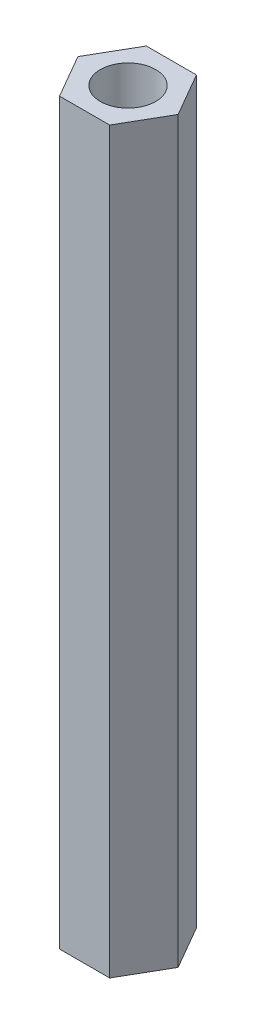
ISO-10303-21;
HEADER;
FILE_DESCRIPTION(('STEP AP214'),'2;1');
FILE_NAME('part.step','',(''),(''),'','','');
FILE_SCHEMA(('AUTOMOTIVE_DESIGN { 1 0 10303 214 1 1 1 1 }'));
ENDSEC;
DATA;
#1=APPLICATION_CONTEXT('core data for automotive mechanical design processes');
#2=APPLICATION_PROTOCOL_DEFINITION('international standard','automotive_design',2000,#1);
#3=PRODUCT_CONTEXT('',#1,'mechanical');
#4=PRODUCT('Part','Part','',(#3));
#5=PRODUCT_RELATED_PRODUCT_CATEGORY('part','',(#4));
#6=PRODUCT_DEFINITION_FORMATION('','',#4);
#7=PRODUCT_DEFINITION_CONTEXT('part definition',#1,'design');
#8=PRODUCT_DEFINITION('design','',#6,#7);
#9=PRODUCT_DEFINITION_SHAPE('','',#8);
#10=(LENGTH_UNIT() NAMED_UNIT(*) SI_UNIT(.MILLI.,.METRE.));
#11=(NAMED_UNIT(*) PLANE_ANGLE_UNIT() SI_UNIT($,.RADIAN.));
#12=(NAMED_UNIT(*) SI_UNIT($,.STERADIAN.) SOLID_ANGLE_UNIT());
#13=UNCERTAINTY_MEASURE_WITH_UNIT(LENGTH_MEASURE(1.E-05),#10,'distance_accuracy_value','');
#14=(GEOMETRIC_REPRESENTATION_CONTEXT(3) GLOBAL_UNCERTAINTY_ASSIGNED_CONTEXT((#13)) GLOBAL_UNIT_ASSIGNED_CONTEXT((#10,
#11,#12)) REPRESENTATION_CONTEXT('',''));
#15=CARTESIAN_POINT('',(0.,0.,0.));
#16=DIRECTION('',(0.,0.,1.));
#17=DIRECTION('',(1.,0.,0.));
#18=AXIS2_PLACEMENT_3D('',#15,#16,#17);
#19=CARTESIAN_POINT('',(0.,40.,0.));
#20=DIRECTION('',(0.,1.,0.));
#21=DIRECTION('',(0.,0.,1.));
#22=AXIS2_PLACEMENT_3D('',#19,#20,#21);
#23=PLANE('',#22);
#24=DIRECTION('',(0.5,0.,-0.866025403784439));
#25=VECTOR('',#24,1.);
#26=CARTESIAN_POINT('',(1.35677313259562,40.,2.35));
#27=LINE('',#26,#25);
#28=CARTESIAN_POINT('',(1.35677313259562,40.,2.35));
#29=VERTEX_POINT('',#28);
#30=CARTESIAN_POINT('',(2.71354626519124,40.,0.));
#31=VERTEX_POINT('',#30);
#32=EDGE_CURVE('E131',#29,#31,#27,.T.);
#33=ORIENTED_EDGE('',*,*,#32,.T.);
#34=DIRECTION('',(-0.5,0.,-0.866025403784439));
#35=VECTOR('',#34,1.);
#36=CARTESIAN_POINT('',(2.71354626519124,40.,0.));
#37=LINE('',#36,#35);
#38=CARTESIAN_POINT('',(1.35677313259562,40.,-2.35));
#39=VERTEX_POINT('',#38);
#40=EDGE_CURVE('E89',#31,#39,#37,.T.);
#41=ORIENTED_EDGE('',*,*,#40,.T.);
#42=DIRECTION('',(-1.,0.,0.));
#43=VECTOR('',#42,1.);
#44=CARTESIAN_POINT('',(1.35677313259562,40.,-2.35));
#45=LINE('',#44,#43);
#46=CARTESIAN_POINT('',(-1.35677313259562,40.,-2.35));
#47=VERTEX_POINT('',#46);
#48=EDGE_CURVE('E102',#39,#47,#45,.T.);
#49=ORIENTED_EDGE('',*,*,#48,.T.);
#50=DIRECTION('',(-0.5,0.,0.866025403784439));
#51=VECTOR('',#50,1.);
#52=CARTESIAN_POINT('',(-1.35677313259562,40.,-2.35));
#53=LINE('',#52,#51);
#54=CARTESIAN_POINT('',(-2.71354626519124,40.,0.));
#55=VERTEX_POINT('',#54);
#56=EDGE_CURVE('E96',#47,#55,#53,.T.);
#57=ORIENTED_EDGE('',*,*,#56,.T.);
#58=DIRECTION('',(0.5,0.,0.866025403784439));
#59=VECTOR('',#58,1.);
#60=CARTESIAN_POINT('',(-2.71354626519124,40.,0.));
#61=LINE('',#60,#59);
#62=CARTESIAN_POINT('',(-1.35677313259562,40.,2.35));
#63=VERTEX_POINT('',#62);
#64=EDGE_CURVE('E100',#55,#63,#61,.T.);
#65=ORIENTED_EDGE('',*,*,#64,.T.);
#66=DIRECTION('',(1.,0.,0.));
#67=VECTOR('',#66,1.);
#68=CARTESIAN_POINT('',(-1.35677313259562,40.,2.35));
#69=LINE('',#68,#67);
#70=EDGE_CURVE('E52',#63,#29,#69,.T.);
#71=ORIENTED_EDGE('',*,*,#70,.T.);
#72=EDGE_LOOP('',(#33,#41,#49,#57,#65,#71));
#73=FACE_BOUND('',#72,.T.);
#74=CARTESIAN_POINT('',(0.,40.,0.));
#75=DIRECTION('',(0.,1.,0.));
#76=DIRECTION('',(0.,0.,1.));
#77=AXIS2_PLACEMENT_3D('',#74,#75,#76);
#78=CIRCLE('',#77,1.5);
#79=CARTESIAN_POINT('',(0.,40.,1.5));
#80=VERTEX_POINT('',#79);
#81=EDGE_CURVE('E124',#80,#80,#78,.T.);
#82=ORIENTED_EDGE('',*,*,#81,.F.);
#83=EDGE_LOOP('',(#82));
#84=FACE_BOUND('',#83,.T.);
#85=ADVANCED_FACE('F35',(#73,#84),#23,.T.);
#86=CARTESIAN_POINT('',(0.,0.,0.));
#87=DIRECTION('',(0.,1.,0.));
#88=DIRECTION('',(0.,0.,1.));
#89=AXIS2_PLACEMENT_3D('',#86,#87,#88);
#90=PLANE('',#89);
#91=DIRECTION('',(0.5,0.,-0.866025403784439));
#92=VECTOR('',#91,1.);
#93=CARTESIAN_POINT('',(1.35677313259562,0.,2.35));
#94=LINE('',#93,#92);
#95=CARTESIAN_POINT('',(1.35677313259562,0.,2.35));
#96=VERTEX_POINT('',#95);
#97=CARTESIAN_POINT('',(2.71354626519124,0.,0.));
#98=VERTEX_POINT('',#97);
#99=EDGE_CURVE('E120',#96,#98,#94,.T.);
#100=ORIENTED_EDGE('',*,*,#99,.F.);
#101=DIRECTION('',(1.,0.,0.));
#102=VECTOR('',#101,1.);
#103=CARTESIAN_POINT('',(-1.35677313259562,0.,2.35));
#104=LINE('',#103,#102);
#105=CARTESIAN_POINT('',(-1.35677313259562,0.,2.35));
#106=VERTEX_POINT('',#105);
#107=EDGE_CURVE('E81',#106,#96,#104,.T.);
#108=ORIENTED_EDGE('',*,*,#107,.F.);
#109=DIRECTION('',(0.5,0.,0.866025403784439));
#110=VECTOR('',#109,1.);
#111=CARTESIAN_POINT('',(-2.71354626519124,0.,0.));
#112=LINE('',#111,#110);
#113=CARTESIAN_POINT('',(-2.71354626519124,0.,0.));
#114=VERTEX_POINT('',#113);
#115=EDGE_CURVE('E75',#114,#106,#112,.T.);
#116=ORIENTED_EDGE('',*,*,#115,.F.);
#117=DIRECTION('',(-0.5,0.,0.866025403784439));
#118=VECTOR('',#117,1.);
#119=CARTESIAN_POINT('',(-1.35677313259562,0.,-2.35));
#120=LINE('',#119,#118);
#121=CARTESIAN_POINT('',(-1.35677313259562,0.,-2.35));
#122=VERTEX_POINT('',#121);
#123=EDGE_CURVE('E110',#122,#114,#120,.T.);
#124=ORIENTED_EDGE('',*,*,#123,.F.);
#125=DIRECTION('',(-1.,0.,0.));
#126=VECTOR('',#125,1.);
#127=CARTESIAN_POINT('',(1.35677313259562,0.,-2.35));
#128=LINE('',#127,#126);
#129=CARTESIAN_POINT('',(1.35677313259562,0.,-2.35));
#130=VERTEX_POINT('',#129);
#131=EDGE_CURVE('E126',#130,#122,#128,.T.);
#132=ORIENTED_EDGE('',*,*,#131,.F.);
#133=DIRECTION('',(-0.5,0.,-0.866025403784439));
#134=VECTOR('',#133,1.);
#135=CARTESIAN_POINT('',(2.71354626519124,0.,0.));
#136=LINE('',#135,#134);
#137=EDGE_CURVE('E123',#98,#130,#136,.T.);
#138=ORIENTED_EDGE('',*,*,#137,.F.);
#139=EDGE_LOOP('',(#100,#108,#116,#124,#132,#138));
#140=FACE_BOUND('',#139,.T.);
#141=CARTESIAN_POINT('',(0.,0.,0.));
#142=DIRECTION('',(0.,1.,0.));
#143=DIRECTION('',(0.,0.,1.));
#144=AXIS2_PLACEMENT_3D('',#141,#142,#143);
#145=CIRCLE('',#144,1.5);
#146=CARTESIAN_POINT('',(0.,0.,1.5));
#147=VERTEX_POINT('',#146);
#148=EDGE_CURVE('E224',#147,#147,#145,.T.);
#149=ORIENTED_EDGE('',*,*,#148,.T.);
#150=EDGE_LOOP('',(#149));
#151=FACE_BOUND('',#150,.T.);
#152=ADVANCED_FACE('F140',(#140,#151),#90,.F.);
#153=CARTESIAN_POINT('',(1.35677313259562,40.,2.35));
#154=DIRECTION('',(-0.866025403784439,0.,-0.5));
#155=DIRECTION('',(-0.5,0.,0.866025403784439));
#156=AXIS2_PLACEMENT_3D('',#153,#154,#155);
#157=PLANE('',#156);
#158=ORIENTED_EDGE('',*,*,#99,.T.);
#159=DIRECTION('',(0.,-1.,0.));
#160=VECTOR('',#159,1.);
#161=CARTESIAN_POINT('',(2.71354626519124,40.,0.));
#162=LINE('',#161,#160);
#163=EDGE_CURVE('E11',#31,#98,#162,.T.);
#164=ORIENTED_EDGE('',*,*,#163,.F.);
#165=ORIENTED_EDGE('',*,*,#32,.F.);
#166=DIRECTION('',(0.,-1.,0.));
#167=VECTOR('',#166,1.);
#168=CARTESIAN_POINT('',(1.35677313259562,40.,2.35));
#169=LINE('',#168,#167);
#170=EDGE_CURVE('E116',#29,#96,#169,.T.);
#171=ORIENTED_EDGE('',*,*,#170,.T.);
#172=EDGE_LOOP('',(#158,#164,#165,#171));
#173=FACE_BOUND('',#172,.T.);
#174=ADVANCED_FACE('F37',(#173),#157,.F.);
#175=CARTESIAN_POINT('',(2.71354626519124,40.,0.));
#176=DIRECTION('',(-0.866025403784439,0.,0.5));
#177=DIRECTION('',(0.5,0.,0.866025403784439));
#178=AXIS2_PLACEMENT_3D('',#175,#176,#177);
#179=PLANE('',#178);
#180=ORIENTED_EDGE('',*,*,#137,.T.);
#181=DIRECTION('',(0.,-1.,0.));
#182=VECTOR('',#181,1.);
#183=CARTESIAN_POINT('',(1.35677313259562,40.,-2.35));
#184=LINE('',#183,#182);
#185=EDGE_CURVE('E44',#39,#130,#184,.T.);
#186=ORIENTED_EDGE('',*,*,#185,.F.);
#187=ORIENTED_EDGE('',*,*,#40,.F.);
#188=ORIENTED_EDGE('',*,*,#163,.T.);
#189=EDGE_LOOP('',(#180,#186,#187,#188));
#190=FACE_BOUND('',#189,.T.);
#191=ADVANCED_FACE('F165',(#190),#179,.F.);
#192=CARTESIAN_POINT('',(1.35677313259562,40.,-2.35));
#193=DIRECTION('',(0.,0.,1.));
#194=DIRECTION('',(1.,0.,0.));
#195=AXIS2_PLACEMENT_3D('',#192,#193,#194);
#196=PLANE('',#195);
#197=ORIENTED_EDGE('',*,*,#131,.T.);
#198=DIRECTION('',(0.,-1.,0.));
#199=VECTOR('',#198,1.);
#200=CARTESIAN_POINT('',(-1.35677313259562,40.,-2.35));
#201=LINE('',#200,#199);
#202=EDGE_CURVE('E111',#47,#122,#201,.T.);
#203=ORIENTED_EDGE('',*,*,#202,.F.);
#204=ORIENTED_EDGE('',*,*,#48,.F.);
#205=ORIENTED_EDGE('',*,*,#185,.T.);
#206=EDGE_LOOP('',(#197,#203,#204,#205));
#207=FACE_BOUND('',#206,.T.);
#208=ADVANCED_FACE('F137',(#207),#196,.F.);
#209=CARTESIAN_POINT('',(-1.35677313259562,40.,-2.35));
#210=DIRECTION('',(0.866025403784439,0.,0.5));
#211=DIRECTION('',(0.5,0.,-0.866025403784439));
#212=AXIS2_PLACEMENT_3D('',#209,#210,#211);
#213=PLANE('',#212);
#214=ORIENTED_EDGE('',*,*,#123,.T.);
#215=DIRECTION('',(0.,-1.,0.));
#216=VECTOR('',#215,1.);
#217=CARTESIAN_POINT('',(-2.71354626519124,40.,0.));
#218=LINE('',#217,#216);
#219=EDGE_CURVE('E107',#55,#114,#218,.T.);
#220=ORIENTED_EDGE('',*,*,#219,.F.);
#221=ORIENTED_EDGE('',*,*,#56,.F.);
#222=ORIENTED_EDGE('',*,*,#202,.T.);
#223=EDGE_LOOP('',(#214,#220,#221,#222));
#224=FACE_BOUND('',#223,.T.);
#225=ADVANCED_FACE('F108',(#224),#213,.F.);
#226=CARTESIAN_POINT('',(-2.71354626519124,40.,0.));
#227=DIRECTION('',(0.866025403784439,0.,-0.5));
#228=DIRECTION('',(-0.5,0.,-0.866025403784439));
#229=AXIS2_PLACEMENT_3D('',#226,#227,#228);
#230=PLANE('',#229);
#231=ORIENTED_EDGE('',*,*,#115,.T.);
#232=DIRECTION('',(0.,-1.,0.));
#233=VECTOR('',#232,1.);
#234=CARTESIAN_POINT('',(-1.35677313259562,40.,2.35));
#235=LINE('',#234,#233);
#236=EDGE_CURVE('E112',#63,#106,#235,.T.);
#237=ORIENTED_EDGE('',*,*,#236,.F.);
#238=ORIENTED_EDGE('',*,*,#64,.F.);
#239=ORIENTED_EDGE('',*,*,#219,.T.);
#240=EDGE_LOOP('',(#231,#237,#238,#239));
#241=FACE_BOUND('',#240,.T.);
#242=ADVANCED_FACE('F114',(#241),#230,.F.);
#243=CARTESIAN_POINT('',(-1.35677313259562,40.,2.35));
#244=DIRECTION('',(0.,0.,-1.));
#245=DIRECTION('',(-1.,0.,0.));
#246=AXIS2_PLACEMENT_3D('',#243,#244,#245);
#247=PLANE('',#246);
#248=ORIENTED_EDGE('',*,*,#107,.T.);
#249=ORIENTED_EDGE('',*,*,#170,.F.);
#250=ORIENTED_EDGE('',*,*,#70,.F.);
#251=ORIENTED_EDGE('',*,*,#236,.T.);
#252=EDGE_LOOP('',(#248,#249,#250,#251));
#253=FACE_BOUND('',#252,.T.);
#254=ADVANCED_FACE('F145',(#253),#247,.F.);
#255=CARTESIAN_POINT('',(0.,40.,0.));
#256=DIRECTION('',(0.,-1.,0.));
#257=DIRECTION('',(0.,0.,-1.));
#258=AXIS2_PLACEMENT_3D('',#255,#256,#257);
#259=CYLINDRICAL_SURFACE('',#258,1.5);
#260=ORIENTED_EDGE('',*,*,#81,.T.);
#261=EDGE_LOOP('',(#260));
#262=FACE_BOUND('',#261,.T.);
#263=ORIENTED_EDGE('',*,*,#148,.F.);
#264=EDGE_LOOP('',(#263));
#265=FACE_BOUND('',#264,.T.);
#266=ADVANCED_FACE('F147',(#262,#265),#259,.F.);
#267=CLOSED_SHELL('',(#85,#152,#174,#191,#208,#225,#242,#254,#266));
#268=MANIFOLD_SOLID_BREP('B2',#267);
#269=ADVANCED_BREP_SHAPE_REPRESENTATION('',(#18,#268),#14);
#270=SHAPE_DEFINITION_REPRESENTATION(#9,#269);
ENDSEC;
END-ISO-10303-21;
